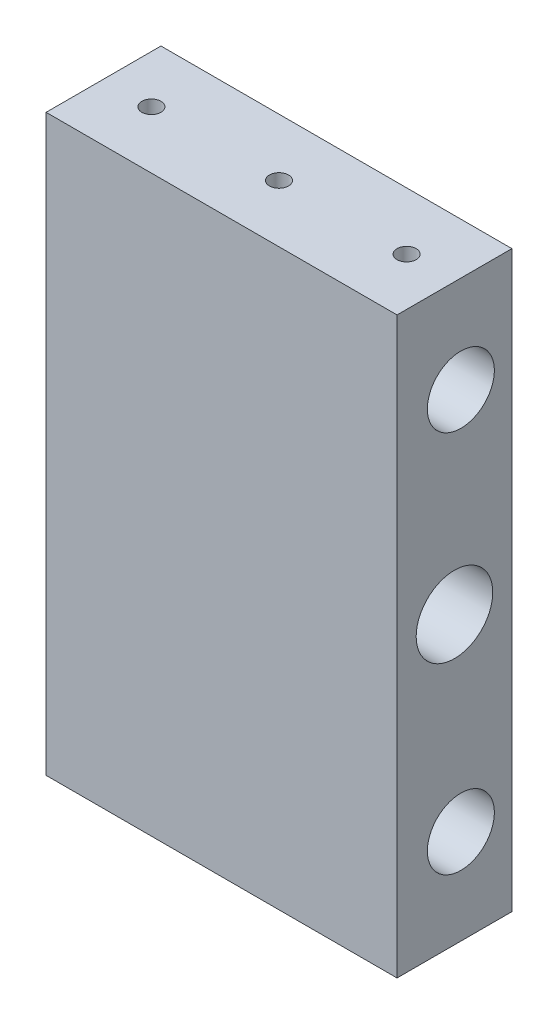
ISO-10303-21;
HEADER;
FILE_DESCRIPTION(('STEP AP214'),'2;1');
FILE_NAME('part.step','',(''),(''),'','','');
FILE_SCHEMA(('AUTOMOTIVE_DESIGN { 1 0 10303 214 1 1 1 1 }'));
ENDSEC;
DATA;
#1=APPLICATION_CONTEXT('core data for automotive mechanical design processes');
#2=APPLICATION_PROTOCOL_DEFINITION('international standard','automotive_design',2000,#1);
#3=PRODUCT_CONTEXT('',#1,'mechanical');
#4=PRODUCT('Part','Part','',(#3));
#5=PRODUCT_RELATED_PRODUCT_CATEGORY('part','',(#4));
#6=PRODUCT_DEFINITION_FORMATION('','',#4);
#7=PRODUCT_DEFINITION_CONTEXT('part definition',#1,'design');
#8=PRODUCT_DEFINITION('design','',#6,#7);
#9=PRODUCT_DEFINITION_SHAPE('','',#8);
#10=(LENGTH_UNIT() NAMED_UNIT(*) SI_UNIT(.MILLI.,.METRE.));
#11=(NAMED_UNIT(*) PLANE_ANGLE_UNIT() SI_UNIT($,.RADIAN.));
#12=(NAMED_UNIT(*) SI_UNIT($,.STERADIAN.) SOLID_ANGLE_UNIT());
#13=UNCERTAINTY_MEASURE_WITH_UNIT(LENGTH_MEASURE(1.E-05),#10,'distance_accuracy_value','');
#14=(GEOMETRIC_REPRESENTATION_CONTEXT(3) GLOBAL_UNCERTAINTY_ASSIGNED_CONTEXT((#13)) GLOBAL_UNIT_ASSIGNED_CONTEXT((#10,
#11,#12)) REPRESENTATION_CONTEXT('',''));
#15=CARTESIAN_POINT('',(0.,0.,0.));
#16=DIRECTION('',(0.,0.,1.));
#17=DIRECTION('',(1.,0.,0.));
#18=AXIS2_PLACEMENT_3D('',#15,#16,#17);
#19=CARTESIAN_POINT('',(-110.,190.,36.));
#20=DIRECTION('',(0.,1.,0.));
#21=DIRECTION('',(0.,0.,1.));
#22=AXIS2_PLACEMENT_3D('',#19,#20,#21);
#23=PLANE('',#22);
#24=CARTESIAN_POINT('',(-95.,190.,18.));
#25=DIRECTION('',(0.,1.,0.));
#26=DIRECTION('',(0.,0.,1.));
#27=AXIS2_PLACEMENT_3D('',#24,#25,#26);
#28=CIRCLE('',#27,3.);
#29=CARTESIAN_POINT('',(-95.,190.,21.));
#30=VERTEX_POINT('',#29);
#31=EDGE_CURVE('E171',#30,#30,#28,.T.);
#32=ORIENTED_EDGE('',*,*,#31,.F.);
#33=EDGE_LOOP('',(#32));
#34=FACE_BOUND('',#33,.T.);
#35=CARTESIAN_POINT('',(-55.,190.,18.));
#36=DIRECTION('',(0.,1.,0.));
#37=DIRECTION('',(0.,0.,1.));
#38=AXIS2_PLACEMENT_3D('',#35,#36,#37);
#39=CIRCLE('',#38,3.);
#40=CARTESIAN_POINT('',(-55.,190.,21.));
#41=VERTEX_POINT('',#40);
#42=EDGE_CURVE('E165',#41,#41,#39,.T.);
#43=ORIENTED_EDGE('',*,*,#42,.F.);
#44=EDGE_LOOP('',(#43));
#45=FACE_BOUND('',#44,.T.);
#46=CARTESIAN_POINT('',(-15.,190.,18.));
#47=DIRECTION('',(0.,1.,0.));
#48=DIRECTION('',(0.,0.,1.));
#49=AXIS2_PLACEMENT_3D('',#46,#47,#48);
#50=CIRCLE('',#49,3.);
#51=CARTESIAN_POINT('',(-15.,190.,21.));
#52=VERTEX_POINT('',#51);
#53=EDGE_CURVE('E159',#52,#52,#50,.T.);
#54=ORIENTED_EDGE('',*,*,#53,.F.);
#55=EDGE_LOOP('',(#54));
#56=FACE_BOUND('',#55,.T.);
#57=DIRECTION('',(1.,0.,0.));
#58=VECTOR('',#57,1.);
#59=CARTESIAN_POINT('',(-110.,190.,0.));
#60=LINE('',#59,#58);
#61=CARTESIAN_POINT('',(-110.,190.,0.));
#62=VERTEX_POINT('',#61);
#63=CARTESIAN_POINT('',(0.,190.,0.));
#64=VERTEX_POINT('',#63);
#65=EDGE_CURVE('E62',#62,#64,#60,.T.);
#66=ORIENTED_EDGE('',*,*,#65,.F.);
#67=DIRECTION('',(0.,0.,-1.));
#68=VECTOR('',#67,1.);
#69=CARTESIAN_POINT('',(-110.,190.,36.));
#70=LINE('',#69,#68);
#71=CARTESIAN_POINT('',(-110.,190.,36.));
#72=VERTEX_POINT('',#71);
#73=EDGE_CURVE('E11',#72,#62,#70,.T.);
#74=ORIENTED_EDGE('',*,*,#73,.F.);
#75=DIRECTION('',(1.,0.,0.));
#76=VECTOR('',#75,1.);
#77=CARTESIAN_POINT('',(-110.,190.,36.));
#78=LINE('',#77,#76);
#79=CARTESIAN_POINT('',(0.,190.,36.));
#80=VERTEX_POINT('',#79);
#81=EDGE_CURVE('E72',#72,#80,#78,.T.);
#82=ORIENTED_EDGE('',*,*,#81,.T.);
#83=DIRECTION('',(0.,0.,-1.));
#84=VECTOR('',#83,1.);
#85=CARTESIAN_POINT('',(0.,190.,36.));
#86=LINE('',#85,#84);
#87=EDGE_CURVE('E63',#80,#64,#86,.T.);
#88=ORIENTED_EDGE('',*,*,#87,.T.);
#89=EDGE_LOOP('',(#66,#74,#82,#88));
#90=FACE_BOUND('',#89,.T.);
#91=ADVANCED_FACE('F17',(#34,#45,#56,#90),#23,.T.);
#92=CARTESIAN_POINT('',(-110.,0.,36.));
#93=DIRECTION('',(-1.,0.,0.));
#94=DIRECTION('',(0.,0.,1.));
#95=AXIS2_PLACEMENT_3D('',#92,#93,#94);
#96=PLANE('',#95);
#97=CARTESIAN_POINT('',(-110.,88.3862915010152,6.68629150101524));
#98=DIRECTION('',(-1.,0.,0.));
#99=DIRECTION('',(0.,0.,1.));
#100=AXIS2_PLACEMENT_3D('',#97,#98,#99);
#101=CIRCLE('',#100,2.1);
#102=CARTESIAN_POINT('',(-110.,88.3862915010152,8.78629150101524));
#103=VERTEX_POINT('',#102);
#104=EDGE_CURVE('E111',#103,#103,#101,.T.);
#105=ORIENTED_EDGE('',*,*,#104,.F.);
#106=EDGE_LOOP('',(#105));
#107=FACE_BOUND('',#106,.T.);
#108=CARTESIAN_POINT('',(-110.,83.7,18.));
#109=DIRECTION('',(-1.,0.,0.));
#110=DIRECTION('',(0.,0.,1.));
#111=AXIS2_PLACEMENT_3D('',#108,#109,#110);
#112=CIRCLE('',#111,2.1);
#113=CARTESIAN_POINT('',(-110.,83.7,20.1));
#114=VERTEX_POINT('',#113);
#115=EDGE_CURVE('E118',#114,#114,#112,.T.);
#116=ORIENTED_EDGE('',*,*,#115,.F.);
#117=EDGE_LOOP('',(#116));
#118=FACE_BOUND('',#117,.T.);
#119=CARTESIAN_POINT('',(-110.,88.3862915010152,29.3137084989846));
#120=DIRECTION('',(-1.,0.,0.));
#121=DIRECTION('',(0.,0.,1.));
#122=AXIS2_PLACEMENT_3D('',#119,#120,#121);
#123=CIRCLE('',#122,2.1);
#124=CARTESIAN_POINT('',(-110.,88.3862915010152,31.4137084989847));
#125=VERTEX_POINT('',#124);
#126=EDGE_CURVE('E124',#125,#125,#123,.T.);
#127=ORIENTED_EDGE('',*,*,#126,.F.);
#128=EDGE_LOOP('',(#127));
#129=FACE_BOUND('',#128,.T.);
#130=CARTESIAN_POINT('',(-110.,111.013708498985,29.3137084989846));
#131=DIRECTION('',(-1.,0.,0.));
#132=DIRECTION('',(0.,0.,1.));
#133=AXIS2_PLACEMENT_3D('',#130,#131,#132);
#134=CIRCLE('',#133,2.1);
#135=CARTESIAN_POINT('',(-110.,111.013708498985,31.4137084989847));
#136=VERTEX_POINT('',#135);
#137=EDGE_CURVE('E130',#136,#136,#134,.T.);
#138=ORIENTED_EDGE('',*,*,#137,.F.);
#139=EDGE_LOOP('',(#138));
#140=FACE_BOUND('',#139,.T.);
#141=CARTESIAN_POINT('',(-110.,115.7,18.));
#142=DIRECTION('',(-1.,0.,0.));
#143=DIRECTION('',(0.,0.,1.));
#144=AXIS2_PLACEMENT_3D('',#141,#142,#143);
#145=CIRCLE('',#144,2.1);
#146=CARTESIAN_POINT('',(-110.,115.7,20.1));
#147=VERTEX_POINT('',#146);
#148=EDGE_CURVE('E136',#147,#147,#145,.T.);
#149=ORIENTED_EDGE('',*,*,#148,.F.);
#150=EDGE_LOOP('',(#149));
#151=FACE_BOUND('',#150,.T.);
#152=CARTESIAN_POINT('',(-110.,111.013708498985,6.68629150101524));
#153=DIRECTION('',(-1.,0.,0.));
#154=DIRECTION('',(0.,0.,1.));
#155=AXIS2_PLACEMENT_3D('',#152,#153,#154);
#156=CIRCLE('',#155,2.1);
#157=CARTESIAN_POINT('',(-110.,111.013708498985,8.78629150101524));
#158=VERTEX_POINT('',#157);
#159=EDGE_CURVE('E105',#158,#158,#156,.T.);
#160=ORIENTED_EDGE('',*,*,#159,.F.);
#161=EDGE_LOOP('',(#160));
#162=FACE_BOUND('',#161,.T.);
#163=CARTESIAN_POINT('',(-110.,159.7,16.));
#164=DIRECTION('',(-1.,0.,0.));
#165=DIRECTION('',(0.,0.,1.));
#166=AXIS2_PLACEMENT_3D('',#163,#164,#165);
#167=CIRCLE('',#166,10.5);
#168=CARTESIAN_POINT('',(-110.,159.7,26.5));
#169=VERTEX_POINT('',#168);
#170=EDGE_CURVE('E100',#169,#169,#167,.T.);
#171=ORIENTED_EDGE('',*,*,#170,.F.);
#172=EDGE_LOOP('',(#171));
#173=FACE_BOUND('',#172,.T.);
#174=CARTESIAN_POINT('',(-110.,39.7,16.));
#175=DIRECTION('',(-1.,0.,0.));
#176=DIRECTION('',(0.,0.,1.));
#177=AXIS2_PLACEMENT_3D('',#174,#175,#176);
#178=CIRCLE('',#177,10.5);
#179=CARTESIAN_POINT('',(-110.,39.7,26.5));
#180=VERTEX_POINT('',#179);
#181=EDGE_CURVE('E94',#180,#180,#178,.T.);
#182=ORIENTED_EDGE('',*,*,#181,.F.);
#183=EDGE_LOOP('',(#182));
#184=FACE_BOUND('',#183,.T.);
#185=CARTESIAN_POINT('',(-110.,99.7,18.));
#186=DIRECTION('',(-1.,0.,0.));
#187=DIRECTION('',(0.,0.,1.));
#188=AXIS2_PLACEMENT_3D('',#185,#186,#187);
#189=CIRCLE('',#188,12.);
#190=CARTESIAN_POINT('',(-110.,99.7,30.));
#191=VERTEX_POINT('',#190);
#192=EDGE_CURVE('E87',#191,#191,#189,.T.);
#193=ORIENTED_EDGE('',*,*,#192,.F.);
#194=EDGE_LOOP('',(#193));
#195=FACE_BOUND('',#194,.T.);
#196=DIRECTION('',(0.,1.,0.));
#197=VECTOR('',#196,1.);
#198=CARTESIAN_POINT('',(-110.,0.,0.));
#199=LINE('',#198,#197);
#200=CARTESIAN_POINT('',(-110.,10.,0.));
#201=VERTEX_POINT('',#200);
#202=EDGE_CURVE('E58',#201,#62,#199,.T.);
#203=ORIENTED_EDGE('',*,*,#202,.F.);
#204=DIRECTION('',(0.,0.,-1.));
#205=VECTOR('',#204,1.);
#206=CARTESIAN_POINT('',(-110.,10.,36.));
#207=LINE('',#206,#205);
#208=CARTESIAN_POINT('',(-110.,10.,36.));
#209=VERTEX_POINT('',#208);
#210=EDGE_CURVE('E25',#209,#201,#207,.T.);
#211=ORIENTED_EDGE('',*,*,#210,.F.);
#212=DIRECTION('',(0.,1.,0.));
#213=VECTOR('',#212,1.);
#214=CARTESIAN_POINT('',(-110.,0.,36.));
#215=LINE('',#214,#213);
#216=EDGE_CURVE('E60',#209,#72,#215,.T.);
#217=ORIENTED_EDGE('',*,*,#216,.T.);
#218=ORIENTED_EDGE('',*,*,#73,.T.);
#219=EDGE_LOOP('',(#203,#211,#217,#218));
#220=FACE_BOUND('',#219,.T.);
#221=ADVANCED_FACE('F56',(#107,#118,#129,#140,#151,#162,#173,#184,#195,#220),#96,.T.);
#222=CARTESIAN_POINT('',(0.,10.,36.));
#223=DIRECTION('',(0.,-1.,0.));
#224=DIRECTION('',(0.,0.,-1.));
#225=AXIS2_PLACEMENT_3D('',#222,#223,#224);
#226=PLANE('',#225);
#227=CARTESIAN_POINT('',(-15.,10.,18.));
#228=DIRECTION('',(0.,-1.,0.));
#229=DIRECTION('',(0.,0.,-1.));
#230=AXIS2_PLACEMENT_3D('',#227,#228,#229);
#231=CIRCLE('',#230,3.);
#232=CARTESIAN_POINT('',(-15.,10.,15.));
#233=VERTEX_POINT('',#232);
#234=EDGE_CURVE('E154',#233,#233,#231,.T.);
#235=ORIENTED_EDGE('',*,*,#234,.F.);
#236=EDGE_LOOP('',(#235));
#237=FACE_BOUND('',#236,.T.);
#238=CARTESIAN_POINT('',(-55.,10.,18.));
#239=DIRECTION('',(0.,-1.,0.));
#240=DIRECTION('',(0.,0.,-1.));
#241=AXIS2_PLACEMENT_3D('',#238,#239,#240);
#242=CIRCLE('',#241,3.);
#243=CARTESIAN_POINT('',(-55.,10.,15.));
#244=VERTEX_POINT('',#243);
#245=EDGE_CURVE('E148',#244,#244,#242,.T.);
#246=ORIENTED_EDGE('',*,*,#245,.F.);
#247=EDGE_LOOP('',(#246));
#248=FACE_BOUND('',#247,.T.);
#249=CARTESIAN_POINT('',(-95.,10.,18.));
#250=DIRECTION('',(0.,-1.,0.));
#251=DIRECTION('',(0.,0.,-1.));
#252=AXIS2_PLACEMENT_3D('',#249,#250,#251);
#253=CIRCLE('',#252,3.);
#254=CARTESIAN_POINT('',(-95.,10.,15.));
#255=VERTEX_POINT('',#254);
#256=EDGE_CURVE('E141',#255,#255,#253,.T.);
#257=ORIENTED_EDGE('',*,*,#256,.F.);
#258=EDGE_LOOP('',(#257));
#259=FACE_BOUND('',#258,.T.);
#260=DIRECTION('',(-1.,0.,0.));
#261=VECTOR('',#260,1.);
#262=CARTESIAN_POINT('',(0.,10.,0.));
#263=LINE('',#262,#261);
#264=CARTESIAN_POINT('',(0.,10.,0.));
#265=VERTEX_POINT('',#264);
#266=EDGE_CURVE('E71',#265,#201,#263,.T.);
#267=ORIENTED_EDGE('',*,*,#266,.F.);
#268=DIRECTION('',(0.,0.,-1.));
#269=VECTOR('',#268,1.);
#270=CARTESIAN_POINT('',(0.,10.,36.));
#271=LINE('',#270,#269);
#272=CARTESIAN_POINT('',(0.,10.,36.));
#273=VERTEX_POINT('',#272);
#274=EDGE_CURVE('E80',#273,#265,#271,.T.);
#275=ORIENTED_EDGE('',*,*,#274,.F.);
#276=DIRECTION('',(-1.,0.,0.));
#277=VECTOR('',#276,1.);
#278=CARTESIAN_POINT('',(0.,10.,36.));
#279=LINE('',#278,#277);
#280=EDGE_CURVE('E81',#273,#209,#279,.T.);
#281=ORIENTED_EDGE('',*,*,#280,.T.);
#282=ORIENTED_EDGE('',*,*,#210,.T.);
#283=EDGE_LOOP('',(#267,#275,#281,#282));
#284=FACE_BOUND('',#283,.T.);
#285=ADVANCED_FACE('F301',(#237,#248,#259,#284),#226,.T.);
#286=CARTESIAN_POINT('',(0.,200.,36.));
#287=DIRECTION('',(1.,0.,0.));
#288=DIRECTION('',(0.,1.,0.));
#289=AXIS2_PLACEMENT_3D('',#286,#287,#288);
#290=PLANE('',#289);
#291=CARTESIAN_POINT('',(0.,159.7,16.));
#292=DIRECTION('',(-1.,0.,0.));
#293=DIRECTION('',(0.,0.,1.));
#294=AXIS2_PLACEMENT_3D('',#291,#292,#293);
#295=CIRCLE('',#294,10.5);
#296=CARTESIAN_POINT('',(0.,159.7,26.5));
#297=VERTEX_POINT('',#296);
#298=EDGE_CURVE('E68',#297,#297,#295,.T.);
#299=ORIENTED_EDGE('',*,*,#298,.T.);
#300=EDGE_LOOP('',(#299));
#301=FACE_BOUND('',#300,.T.);
#302=CARTESIAN_POINT('',(0.,39.7,16.));
#303=DIRECTION('',(-1.,0.,0.));
#304=DIRECTION('',(0.,0.,1.));
#305=AXIS2_PLACEMENT_3D('',#302,#303,#304);
#306=CIRCLE('',#305,10.5);
#307=CARTESIAN_POINT('',(0.,39.7,26.5));
#308=VERTEX_POINT('',#307);
#309=EDGE_CURVE('E97',#308,#308,#306,.T.);
#310=ORIENTED_EDGE('',*,*,#309,.T.);
#311=EDGE_LOOP('',(#310));
#312=FACE_BOUND('',#311,.T.);
#313=CARTESIAN_POINT('',(0.,99.7,18.));
#314=DIRECTION('',(-1.,0.,0.));
#315=DIRECTION('',(0.,0.,1.));
#316=AXIS2_PLACEMENT_3D('',#313,#314,#315);
#317=CIRCLE('',#316,12.);
#318=CARTESIAN_POINT('',(0.,99.7,30.));
#319=VERTEX_POINT('',#318);
#320=EDGE_CURVE('E90',#319,#319,#317,.T.);
#321=ORIENTED_EDGE('',*,*,#320,.T.);
#322=EDGE_LOOP('',(#321));
#323=FACE_BOUND('',#322,.T.);
#324=DIRECTION('',(0.,-1.,0.));
#325=VECTOR('',#324,1.);
#326=CARTESIAN_POINT('',(0.,200.,0.));
#327=LINE('',#326,#325);
#328=EDGE_CURVE('E67',#64,#265,#327,.T.);
#329=ORIENTED_EDGE('',*,*,#328,.F.);
#330=ORIENTED_EDGE('',*,*,#87,.F.);
#331=DIRECTION('',(0.,-1.,0.));
#332=VECTOR('',#331,1.);
#333=CARTESIAN_POINT('',(0.,200.,36.));
#334=LINE('',#333,#332);
#335=EDGE_CURVE('E74',#80,#273,#334,.T.);
#336=ORIENTED_EDGE('',*,*,#335,.T.);
#337=ORIENTED_EDGE('',*,*,#274,.T.);
#338=EDGE_LOOP('',(#329,#330,#336,#337));
#339=FACE_BOUND('',#338,.T.);
#340=ADVANCED_FACE('F295',(#301,#312,#323,#339),#290,.T.);
#341=CARTESIAN_POINT('',(0.,0.,36.));
#342=DIRECTION('',(0.,0.,-1.));
#343=DIRECTION('',(-1.,0.,0.));
#344=AXIS2_PLACEMENT_3D('',#341,#342,#343);
#345=PLANE('',#344);
#346=ORIENTED_EDGE('',*,*,#81,.F.);
#347=ORIENTED_EDGE('',*,*,#216,.F.);
#348=ORIENTED_EDGE('',*,*,#280,.F.);
#349=ORIENTED_EDGE('',*,*,#335,.F.);
#350=EDGE_LOOP('',(#346,#347,#348,#349));
#351=FACE_BOUND('',#350,.T.);
#352=ADVANCED_FACE('F292',(#351),#345,.F.);
#353=CARTESIAN_POINT('',(0.,0.,0.));
#354=DIRECTION('',(0.,0.,-1.));
#355=DIRECTION('',(-1.,0.,0.));
#356=AXIS2_PLACEMENT_3D('',#353,#354,#355);
#357=PLANE('',#356);
#358=ORIENTED_EDGE('',*,*,#65,.T.);
#359=ORIENTED_EDGE('',*,*,#328,.T.);
#360=ORIENTED_EDGE('',*,*,#266,.T.);
#361=ORIENTED_EDGE('',*,*,#202,.T.);
#362=EDGE_LOOP('',(#358,#359,#360,#361));
#363=FACE_BOUND('',#362,.T.);
#364=ADVANCED_FACE('F70',(#363),#357,.T.);
#365=CARTESIAN_POINT('',(0.,99.7,18.));
#366=DIRECTION('',(-1.,0.,0.));
#367=DIRECTION('',(0.,0.,1.));
#368=AXIS2_PLACEMENT_3D('',#365,#366,#367);
#369=CYLINDRICAL_SURFACE('',#368,12.);
#370=ORIENTED_EDGE('',*,*,#320,.F.);
#371=EDGE_LOOP('',(#370));
#372=FACE_BOUND('',#371,.T.);
#373=ORIENTED_EDGE('',*,*,#192,.T.);
#374=EDGE_LOOP('',(#373));
#375=FACE_BOUND('',#374,.T.);
#376=ADVANCED_FACE('F287',(#372,#375),#369,.F.);
#377=CARTESIAN_POINT('',(0.,39.7,16.));
#378=DIRECTION('',(-1.,0.,0.));
#379=DIRECTION('',(0.,0.,1.));
#380=AXIS2_PLACEMENT_3D('',#377,#378,#379);
#381=CYLINDRICAL_SURFACE('',#380,10.5);
#382=ORIENTED_EDGE('',*,*,#309,.F.);
#383=EDGE_LOOP('',(#382));
#384=FACE_BOUND('',#383,.T.);
#385=ORIENTED_EDGE('',*,*,#181,.T.);
#386=EDGE_LOOP('',(#385));
#387=FACE_BOUND('',#386,.T.);
#388=ADVANCED_FACE('F283',(#384,#387),#381,.F.);
#389=CARTESIAN_POINT('',(0.,159.7,16.));
#390=DIRECTION('',(-1.,0.,0.));
#391=DIRECTION('',(0.,0.,1.));
#392=AXIS2_PLACEMENT_3D('',#389,#390,#391);
#393=CYLINDRICAL_SURFACE('',#392,10.5);
#394=ORIENTED_EDGE('',*,*,#298,.F.);
#395=EDGE_LOOP('',(#394));
#396=FACE_BOUND('',#395,.T.);
#397=ORIENTED_EDGE('',*,*,#170,.T.);
#398=EDGE_LOOP('',(#397));
#399=FACE_BOUND('',#398,.T.);
#400=ADVANCED_FACE('F279',(#396,#399),#393,.F.);
#401=CARTESIAN_POINT('',(-100.,111.013708498985,6.68629150101524));
#402=DIRECTION('',(-1.,0.,0.));
#403=DIRECTION('',(0.,0.,1.));
#404=AXIS2_PLACEMENT_3D('',#401,#402,#403);
#405=CYLINDRICAL_SURFACE('',#404,2.1);
#406=CARTESIAN_POINT('',(-100.,111.013708498985,6.68629150101524));
#407=DIRECTION('',(-1.,0.,0.));
#408=DIRECTION('',(0.,0.,1.));
#409=AXIS2_PLACEMENT_3D('',#406,#407,#408);
#410=CIRCLE('',#409,2.1);
#411=CARTESIAN_POINT('',(-100.,111.013708498985,8.78629150101524));
#412=VERTEX_POINT('',#411);
#413=EDGE_CURVE('E91',#412,#412,#410,.T.);
#414=ORIENTED_EDGE('',*,*,#413,.F.);
#415=EDGE_LOOP('',(#414));
#416=FACE_BOUND('',#415,.T.);
#417=ORIENTED_EDGE('',*,*,#159,.T.);
#418=EDGE_LOOP('',(#417));
#419=FACE_BOUND('',#418,.T.);
#420=ADVANCED_FACE('F275',(#416,#419),#405,.F.);
#421=CARTESIAN_POINT('',(-100.,111.013708498985,6.68629150101524));
#422=DIRECTION('',(-1.,0.,0.));
#423=DIRECTION('',(0.,0.,1.));
#424=AXIS2_PLACEMENT_3D('',#421,#422,#423);
#425=PLANE('',#424);
#426=ORIENTED_EDGE('',*,*,#413,.T.);
#427=EDGE_LOOP('',(#426));
#428=FACE_BOUND('',#427,.T.);
#429=ADVANCED_FACE('F241',(#428),#425,.T.);
#430=CARTESIAN_POINT('',(-100.,115.7,18.));
#431=DIRECTION('',(-1.,0.,0.));
#432=DIRECTION('',(0.,0.,1.));
#433=AXIS2_PLACEMENT_3D('',#430,#431,#432);
#434=CYLINDRICAL_SURFACE('',#433,2.1);
#435=CARTESIAN_POINT('',(-100.,115.7,18.));
#436=DIRECTION('',(-1.,0.,0.));
#437=DIRECTION('',(0.,0.,1.));
#438=AXIS2_PLACEMENT_3D('',#435,#436,#437);
#439=CIRCLE('',#438,2.1);
#440=CARTESIAN_POINT('',(-100.,115.7,20.1));
#441=VERTEX_POINT('',#440);
#442=EDGE_CURVE('E108',#441,#441,#439,.T.);
#443=ORIENTED_EDGE('',*,*,#442,.F.);
#444=EDGE_LOOP('',(#443));
#445=FACE_BOUND('',#444,.T.);
#446=ORIENTED_EDGE('',*,*,#148,.T.);
#447=EDGE_LOOP('',(#446));
#448=FACE_BOUND('',#447,.T.);
#449=ADVANCED_FACE('F237',(#445,#448),#434,.F.);
#450=CARTESIAN_POINT('',(-100.,115.7,18.));
#451=DIRECTION('',(-1.,0.,0.));
#452=DIRECTION('',(0.,0.,1.));
#453=AXIS2_PLACEMENT_3D('',#450,#451,#452);
#454=PLANE('',#453);
#455=ORIENTED_EDGE('',*,*,#442,.T.);
#456=EDGE_LOOP('',(#455));
#457=FACE_BOUND('',#456,.T.);
#458=ADVANCED_FACE('F233',(#457),#454,.T.);
#459=CARTESIAN_POINT('',(-100.,111.013708498985,29.3137084989846));
#460=DIRECTION('',(-1.,0.,0.));
#461=DIRECTION('',(0.,0.,1.));
#462=AXIS2_PLACEMENT_3D('',#459,#460,#461);
#463=CYLINDRICAL_SURFACE('',#462,2.1);
#464=CARTESIAN_POINT('',(-100.,111.013708498985,29.3137084989846));
#465=DIRECTION('',(-1.,0.,0.));
#466=DIRECTION('',(0.,0.,1.));
#467=AXIS2_PLACEMENT_3D('',#464,#465,#466);
#468=CIRCLE('',#467,2.1);
#469=CARTESIAN_POINT('',(-100.,111.013708498985,31.4137084989847));
#470=VERTEX_POINT('',#469);
#471=EDGE_CURVE('E133',#470,#470,#468,.T.);
#472=ORIENTED_EDGE('',*,*,#471,.F.);
#473=EDGE_LOOP('',(#472));
#474=FACE_BOUND('',#473,.T.);
#475=ORIENTED_EDGE('',*,*,#137,.T.);
#476=EDGE_LOOP('',(#475));
#477=FACE_BOUND('',#476,.T.);
#478=ADVANCED_FACE('F236',(#474,#477),#463,.F.);
#479=CARTESIAN_POINT('',(-100.,111.013708498985,29.3137084989846));
#480=DIRECTION('',(-1.,0.,0.));
#481=DIRECTION('',(0.,0.,1.));
#482=AXIS2_PLACEMENT_3D('',#479,#480,#481);
#483=PLANE('',#482);
#484=ORIENTED_EDGE('',*,*,#471,.T.);
#485=EDGE_LOOP('',(#484));
#486=FACE_BOUND('',#485,.T.);
#487=ADVANCED_FACE('F243',(#486),#483,.T.);
#488=CARTESIAN_POINT('',(-100.,88.3862915010152,29.3137084989846));
#489=DIRECTION('',(-1.,0.,0.));
#490=DIRECTION('',(0.,0.,1.));
#491=AXIS2_PLACEMENT_3D('',#488,#489,#490);
#492=CYLINDRICAL_SURFACE('',#491,2.1);
#493=CARTESIAN_POINT('',(-100.,88.3862915010152,29.3137084989846));
#494=DIRECTION('',(-1.,0.,0.));
#495=DIRECTION('',(0.,0.,1.));
#496=AXIS2_PLACEMENT_3D('',#493,#494,#495);
#497=CIRCLE('',#496,2.1);
#498=CARTESIAN_POINT('',(-100.,88.3862915010152,31.4137084989847));
#499=VERTEX_POINT('',#498);
#500=EDGE_CURVE('E127',#499,#499,#497,.T.);
#501=ORIENTED_EDGE('',*,*,#500,.F.);
#502=EDGE_LOOP('',(#501));
#503=FACE_BOUND('',#502,.T.);
#504=ORIENTED_EDGE('',*,*,#126,.T.);
#505=EDGE_LOOP('',(#504));
#506=FACE_BOUND('',#505,.T.);
#507=ADVANCED_FACE('F246',(#503,#506),#492,.F.);
#508=CARTESIAN_POINT('',(-100.,88.3862915010152,29.3137084989846));
#509=DIRECTION('',(-1.,0.,0.));
#510=DIRECTION('',(0.,0.,1.));
#511=AXIS2_PLACEMENT_3D('',#508,#509,#510);
#512=PLANE('',#511);
#513=ORIENTED_EDGE('',*,*,#500,.T.);
#514=EDGE_LOOP('',(#513));
#515=FACE_BOUND('',#514,.T.);
#516=ADVANCED_FACE('F251',(#515),#512,.T.);
#517=CARTESIAN_POINT('',(-100.,83.7,18.));
#518=DIRECTION('',(-1.,0.,0.));
#519=DIRECTION('',(0.,0.,1.));
#520=AXIS2_PLACEMENT_3D('',#517,#518,#519);
#521=CYLINDRICAL_SURFACE('',#520,2.1);
#522=CARTESIAN_POINT('',(-100.,83.7,18.));
#523=DIRECTION('',(-1.,0.,0.));
#524=DIRECTION('',(0.,0.,1.));
#525=AXIS2_PLACEMENT_3D('',#522,#523,#524);
#526=CIRCLE('',#525,2.1);
#527=CARTESIAN_POINT('',(-100.,83.7,20.1));
#528=VERTEX_POINT('',#527);
#529=EDGE_CURVE('E121',#528,#528,#526,.T.);
#530=ORIENTED_EDGE('',*,*,#529,.F.);
#531=EDGE_LOOP('',(#530));
#532=FACE_BOUND('',#531,.T.);
#533=ORIENTED_EDGE('',*,*,#115,.T.);
#534=EDGE_LOOP('',(#533));
#535=FACE_BOUND('',#534,.T.);
#536=ADVANCED_FACE('F254',(#532,#535),#521,.F.);
#537=CARTESIAN_POINT('',(-100.,83.7,18.));
#538=DIRECTION('',(-1.,0.,0.));
#539=DIRECTION('',(0.,0.,1.));
#540=AXIS2_PLACEMENT_3D('',#537,#538,#539);
#541=PLANE('',#540);
#542=ORIENTED_EDGE('',*,*,#529,.T.);
#543=EDGE_LOOP('',(#542));
#544=FACE_BOUND('',#543,.T.);
#545=ADVANCED_FACE('F259',(#544),#541,.T.);
#546=CARTESIAN_POINT('',(-100.,88.3862915010152,6.68629150101524));
#547=DIRECTION('',(-1.,0.,0.));
#548=DIRECTION('',(0.,0.,1.));
#549=AXIS2_PLACEMENT_3D('',#546,#547,#548);
#550=CYLINDRICAL_SURFACE('',#549,2.1);
#551=CARTESIAN_POINT('',(-100.,88.3862915010152,6.68629150101524));
#552=DIRECTION('',(-1.,0.,0.));
#553=DIRECTION('',(0.,0.,1.));
#554=AXIS2_PLACEMENT_3D('',#551,#552,#553);
#555=CIRCLE('',#554,2.1);
#556=CARTESIAN_POINT('',(-100.,88.3862915010152,8.78629150101524));
#557=VERTEX_POINT('',#556);
#558=EDGE_CURVE('E114',#557,#557,#555,.T.);
#559=ORIENTED_EDGE('',*,*,#558,.F.);
#560=EDGE_LOOP('',(#559));
#561=FACE_BOUND('',#560,.T.);
#562=ORIENTED_EDGE('',*,*,#104,.T.);
#563=EDGE_LOOP('',(#562));
#564=FACE_BOUND('',#563,.T.);
#565=ADVANCED_FACE('F262',(#561,#564),#550,.F.);
#566=CARTESIAN_POINT('',(-100.,88.3862915010152,6.68629150101524));
#567=DIRECTION('',(-1.,0.,0.));
#568=DIRECTION('',(0.,0.,1.));
#569=AXIS2_PLACEMENT_3D('',#566,#567,#568);
#570=PLANE('',#569);
#571=ORIENTED_EDGE('',*,*,#558,.T.);
#572=EDGE_LOOP('',(#571));
#573=FACE_BOUND('',#572,.T.);
#574=ADVANCED_FACE('F231',(#573),#570,.T.);
#575=CARTESIAN_POINT('',(-95.,20.,18.));
#576=DIRECTION('',(0.,-1.,0.));
#577=DIRECTION('',(0.,0.,-1.));
#578=AXIS2_PLACEMENT_3D('',#575,#576,#577);
#579=CYLINDRICAL_SURFACE('',#578,3.);
#580=CARTESIAN_POINT('',(-95.,20.,18.));
#581=DIRECTION('',(0.,-1.,0.));
#582=DIRECTION('',(0.,0.,-1.));
#583=AXIS2_PLACEMENT_3D('',#580,#581,#582);
#584=CIRCLE('',#583,3.);
#585=CARTESIAN_POINT('',(-95.,20.,15.));
#586=VERTEX_POINT('',#585);
#587=EDGE_CURVE('E144',#586,#586,#584,.T.);
#588=ORIENTED_EDGE('',*,*,#587,.F.);
#589=EDGE_LOOP('',(#588));
#590=FACE_BOUND('',#589,.T.);
#591=ORIENTED_EDGE('',*,*,#256,.T.);
#592=EDGE_LOOP('',(#591));
#593=FACE_BOUND('',#592,.T.);
#594=ADVANCED_FACE('F227',(#590,#593),#579,.F.);
#595=CARTESIAN_POINT('',(-95.,20.,18.));
#596=DIRECTION('',(0.,-1.,0.));
#597=DIRECTION('',(0.,0.,-1.));
#598=AXIS2_PLACEMENT_3D('',#595,#596,#597);
#599=PLANE('',#598);
#600=ORIENTED_EDGE('',*,*,#587,.T.);
#601=EDGE_LOOP('',(#600));
#602=FACE_BOUND('',#601,.T.);
#603=ADVANCED_FACE('F223',(#602),#599,.T.);
#604=CARTESIAN_POINT('',(-55.,20.,18.));
#605=DIRECTION('',(0.,-1.,0.));
#606=DIRECTION('',(0.,0.,-1.));
#607=AXIS2_PLACEMENT_3D('',#604,#605,#606);
#608=CYLINDRICAL_SURFACE('',#607,3.);
#609=CARTESIAN_POINT('',(-55.,20.,18.));
#610=DIRECTION('',(0.,-1.,0.));
#611=DIRECTION('',(0.,0.,-1.));
#612=AXIS2_PLACEMENT_3D('',#609,#610,#611);
#613=CIRCLE('',#612,3.);
#614=CARTESIAN_POINT('',(-55.,20.,15.));
#615=VERTEX_POINT('',#614);
#616=EDGE_CURVE('E151',#615,#615,#613,.T.);
#617=ORIENTED_EDGE('',*,*,#616,.F.);
#618=EDGE_LOOP('',(#617));
#619=FACE_BOUND('',#618,.T.);
#620=ORIENTED_EDGE('',*,*,#245,.T.);
#621=EDGE_LOOP('',(#620));
#622=FACE_BOUND('',#621,.T.);
#623=ADVANCED_FACE('F219',(#619,#622),#608,.F.);
#624=CARTESIAN_POINT('',(-55.,20.,18.));
#625=DIRECTION('',(0.,-1.,0.));
#626=DIRECTION('',(0.,0.,-1.));
#627=AXIS2_PLACEMENT_3D('',#624,#625,#626);
#628=PLANE('',#627);
#629=ORIENTED_EDGE('',*,*,#616,.T.);
#630=EDGE_LOOP('',(#629));
#631=FACE_BOUND('',#630,.T.);
#632=ADVANCED_FACE('F215',(#631),#628,.T.);
#633=CARTESIAN_POINT('',(-15.,20.,18.));
#634=DIRECTION('',(0.,-1.,0.));
#635=DIRECTION('',(0.,0.,-1.));
#636=AXIS2_PLACEMENT_3D('',#633,#634,#635);
#637=CYLINDRICAL_SURFACE('',#636,3.);
#638=CARTESIAN_POINT('',(-15.,20.,18.));
#639=DIRECTION('',(0.,-1.,0.));
#640=DIRECTION('',(0.,0.,-1.));
#641=AXIS2_PLACEMENT_3D('',#638,#639,#640);
#642=CIRCLE('',#641,3.);
#643=CARTESIAN_POINT('',(-15.,20.,15.));
#644=VERTEX_POINT('',#643);
#645=EDGE_CURVE('E115',#644,#644,#642,.T.);
#646=ORIENTED_EDGE('',*,*,#645,.F.);
#647=EDGE_LOOP('',(#646));
#648=FACE_BOUND('',#647,.T.);
#649=ORIENTED_EDGE('',*,*,#234,.T.);
#650=EDGE_LOOP('',(#649));
#651=FACE_BOUND('',#650,.T.);
#652=ADVANCED_FACE('F207',(#648,#651),#637,.F.);
#653=CARTESIAN_POINT('',(-15.,20.,18.));
#654=DIRECTION('',(0.,-1.,0.));
#655=DIRECTION('',(0.,0.,-1.));
#656=AXIS2_PLACEMENT_3D('',#653,#654,#655);
#657=PLANE('',#656);
#658=ORIENTED_EDGE('',*,*,#645,.T.);
#659=EDGE_LOOP('',(#658));
#660=FACE_BOUND('',#659,.T.);
#661=ADVANCED_FACE('F195',(#660),#657,.T.);
#662=CARTESIAN_POINT('',(-15.,180.,18.));
#663=DIRECTION('',(0.,1.,0.));
#664=DIRECTION('',(0.,0.,1.));
#665=AXIS2_PLACEMENT_3D('',#662,#663,#664);
#666=CYLINDRICAL_SURFACE('',#665,3.);
#667=CARTESIAN_POINT('',(-15.,180.,18.));
#668=DIRECTION('',(0.,1.,0.));
#669=DIRECTION('',(0.,0.,1.));
#670=AXIS2_PLACEMENT_3D('',#667,#668,#669);
#671=CIRCLE('',#670,3.);
#672=CARTESIAN_POINT('',(-15.,180.,21.));
#673=VERTEX_POINT('',#672);
#674=EDGE_CURVE('E162',#673,#673,#671,.T.);
#675=ORIENTED_EDGE('',*,*,#674,.F.);
#676=EDGE_LOOP('',(#675));
#677=FACE_BOUND('',#676,.T.);
#678=ORIENTED_EDGE('',*,*,#53,.T.);
#679=EDGE_LOOP('',(#678));
#680=FACE_BOUND('',#679,.T.);
#681=ADVANCED_FACE('F192',(#677,#680),#666,.F.);
#682=CARTESIAN_POINT('',(-15.,180.,18.));
#683=DIRECTION('',(0.,1.,0.));
#684=DIRECTION('',(0.,0.,1.));
#685=AXIS2_PLACEMENT_3D('',#682,#683,#684);
#686=PLANE('',#685);
#687=ORIENTED_EDGE('',*,*,#674,.T.);
#688=EDGE_LOOP('',(#687));
#689=FACE_BOUND('',#688,.T.);
#690=ADVANCED_FACE('F194',(#689),#686,.T.);
#691=CARTESIAN_POINT('',(-55.,180.,18.));
#692=DIRECTION('',(0.,1.,0.));
#693=DIRECTION('',(0.,0.,1.));
#694=AXIS2_PLACEMENT_3D('',#691,#692,#693);
#695=CYLINDRICAL_SURFACE('',#694,3.);
#696=CARTESIAN_POINT('',(-55.,180.,18.));
#697=DIRECTION('',(0.,1.,0.));
#698=DIRECTION('',(0.,0.,1.));
#699=AXIS2_PLACEMENT_3D('',#696,#697,#698);
#700=CIRCLE('',#699,3.);
#701=CARTESIAN_POINT('',(-55.,180.,21.));
#702=VERTEX_POINT('',#701);
#703=EDGE_CURVE('E168',#702,#702,#700,.T.);
#704=ORIENTED_EDGE('',*,*,#703,.F.);
#705=EDGE_LOOP('',(#704));
#706=FACE_BOUND('',#705,.T.);
#707=ORIENTED_EDGE('',*,*,#42,.T.);
#708=EDGE_LOOP('',(#707));
#709=FACE_BOUND('',#708,.T.);
#710=ADVANCED_FACE('F204',(#706,#709),#695,.F.);
#711=CARTESIAN_POINT('',(-55.,180.,18.));
#712=DIRECTION('',(0.,1.,0.));
#713=DIRECTION('',(0.,0.,1.));
#714=AXIS2_PLACEMENT_3D('',#711,#712,#713);
#715=PLANE('',#714);
#716=ORIENTED_EDGE('',*,*,#703,.T.);
#717=EDGE_LOOP('',(#716));
#718=FACE_BOUND('',#717,.T.);
#719=ADVANCED_FACE('F182',(#718),#715,.T.);
#720=CARTESIAN_POINT('',(-95.,180.,18.));
#721=DIRECTION('',(0.,1.,0.));
#722=DIRECTION('',(0.,0.,1.));
#723=AXIS2_PLACEMENT_3D('',#720,#721,#722);
#724=CYLINDRICAL_SURFACE('',#723,3.);
#725=CARTESIAN_POINT('',(-95.,180.,18.));
#726=DIRECTION('',(0.,1.,0.));
#727=DIRECTION('',(0.,0.,1.));
#728=AXIS2_PLACEMENT_3D('',#725,#726,#727);
#729=CIRCLE('',#728,3.);
#730=CARTESIAN_POINT('',(-95.,180.,21.));
#731=VERTEX_POINT('',#730);
#732=EDGE_CURVE('E145',#731,#731,#729,.T.);
#733=ORIENTED_EDGE('',*,*,#732,.F.);
#734=EDGE_LOOP('',(#733));
#735=FACE_BOUND('',#734,.T.);
#736=ORIENTED_EDGE('',*,*,#31,.T.);
#737=EDGE_LOOP('',(#736));
#738=FACE_BOUND('',#737,.T.);
#739=ADVANCED_FACE('F179',(#735,#738),#724,.F.);
#740=CARTESIAN_POINT('',(-95.,180.,18.));
#741=DIRECTION('',(0.,1.,0.));
#742=DIRECTION('',(0.,0.,1.));
#743=AXIS2_PLACEMENT_3D('',#740,#741,#742);
#744=PLANE('',#743);
#745=ORIENTED_EDGE('',*,*,#732,.T.);
#746=EDGE_LOOP('',(#745));
#747=FACE_BOUND('',#746,.T.);
#748=ADVANCED_FACE('F177',(#747),#744,.T.);
#749=CLOSED_SHELL('',(#91,#221,#285,#340,#352,#364,#376,#388,#400,#420,#429,#449,#458,#478,#487,
#507,#516,#536,#545,#565,#574,#594,#603,#623,#632,#652,#661,#681,#690,#710,#719,#739,#748));
#750=MANIFOLD_SOLID_BREP('B1',#749);
#751=ADVANCED_BREP_SHAPE_REPRESENTATION('',(#18,#750),#14);
#752=SHAPE_DEFINITION_REPRESENTATION(#9,#751);
ENDSEC;
END-ISO-10303-21;
